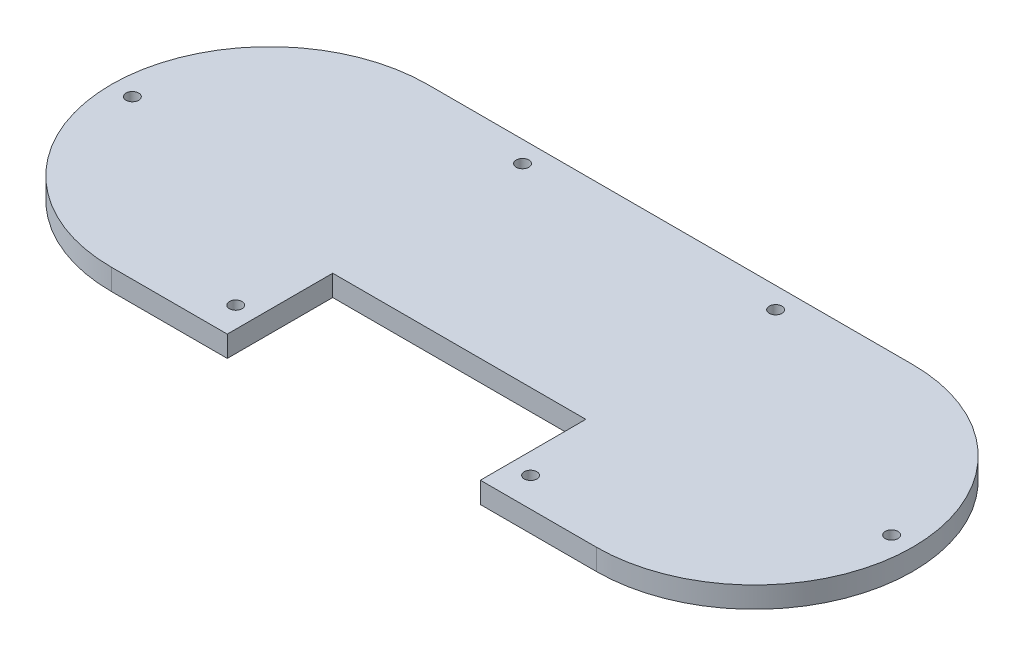
ISO-10303-21;
HEADER;
FILE_DESCRIPTION(('STEP AP214'),'2;1');
FILE_NAME('part.step','',(''),(''),'','','');
FILE_SCHEMA(('AUTOMOTIVE_DESIGN { 1 0 10303 214 1 1 1 1 }'));
ENDSEC;
DATA;
#1=APPLICATION_CONTEXT('core data for automotive mechanical design processes');
#2=APPLICATION_PROTOCOL_DEFINITION('international standard','automotive_design',2000,#1);
#3=PRODUCT_CONTEXT('',#1,'mechanical');
#4=PRODUCT('Part','Part','',(#3));
#5=PRODUCT_RELATED_PRODUCT_CATEGORY('part','',(#4));
#6=PRODUCT_DEFINITION_FORMATION('','',#4);
#7=PRODUCT_DEFINITION_CONTEXT('part definition',#1,'design');
#8=PRODUCT_DEFINITION('design','',#6,#7);
#9=PRODUCT_DEFINITION_SHAPE('','',#8);
#10=(LENGTH_UNIT() NAMED_UNIT(*) SI_UNIT(.MILLI.,.METRE.));
#11=(NAMED_UNIT(*) PLANE_ANGLE_UNIT() SI_UNIT($,.RADIAN.));
#12=(NAMED_UNIT(*) SI_UNIT($,.STERADIAN.) SOLID_ANGLE_UNIT());
#13=UNCERTAINTY_MEASURE_WITH_UNIT(LENGTH_MEASURE(1.E-05),#10,'distance_accuracy_value','');
#14=(GEOMETRIC_REPRESENTATION_CONTEXT(3) GLOBAL_UNCERTAINTY_ASSIGNED_CONTEXT((#13)) GLOBAL_UNIT_ASSIGNED_CONTEXT((#10,
#11,#12)) REPRESENTATION_CONTEXT('',''));
#15=CARTESIAN_POINT('',(0.,0.,0.));
#16=DIRECTION('',(0.,0.,1.));
#17=DIRECTION('',(1.,0.,0.));
#18=AXIS2_PLACEMENT_3D('',#15,#16,#17);
#19=CARTESIAN_POINT('',(57.5,5.,0.));
#20=DIRECTION('',(0.,1.,0.));
#21=DIRECTION('',(0.,0.,1.));
#22=AXIS2_PLACEMENT_3D('',#19,#20,#21);
#23=PLANE('',#22);
#24=CARTESIAN_POINT('',(90.,5.,0.));
#25=DIRECTION('',(0.,1.,0.));
#26=DIRECTION('',(0.,0.,1.));
#27=AXIS2_PLACEMENT_3D('',#24,#25,#26);
#28=CIRCLE('',#27,1.5);
#29=CARTESIAN_POINT('',(90.,5.,1.5));
#30=VERTEX_POINT('',#29);
#31=EDGE_CURVE('E362',#30,#30,#28,.T.);
#32=ORIENTED_EDGE('',*,*,#31,.F.);
#33=EDGE_LOOP('',(#32));
#34=FACE_BOUND('',#33,.T.);
#35=CARTESIAN_POINT('',(-30.,5.,-32.5));
#36=DIRECTION('',(0.,1.,0.));
#37=DIRECTION('',(0.,0.,1.));
#38=AXIS2_PLACEMENT_3D('',#35,#36,#37);
#39=CIRCLE('',#38,1.5);
#40=CARTESIAN_POINT('',(-30.,5.,-31.));
#41=VERTEX_POINT('',#40);
#42=EDGE_CURVE('E350',#41,#41,#39,.T.);
#43=ORIENTED_EDGE('',*,*,#42,.F.);
#44=EDGE_LOOP('',(#43));
#45=FACE_BOUND('',#44,.T.);
#46=CARTESIAN_POINT('',(-34.9497474683058,5.,30.5502525316942));
#47=DIRECTION('',(0.,1.,0.));
#48=DIRECTION('',(0.,0.,1.));
#49=AXIS2_PLACEMENT_3D('',#46,#47,#48);
#50=CIRCLE('',#49,1.50000000000002);
#51=CARTESIAN_POINT('',(-34.9497474683058,5.,32.0502525316942));
#52=VERTEX_POINT('',#51);
#53=EDGE_CURVE('E295',#52,#52,#50,.T.);
#54=ORIENTED_EDGE('',*,*,#53,.F.);
#55=EDGE_LOOP('',(#54));
#56=FACE_BOUND('',#55,.T.);
#57=DIRECTION('',(1.,0.,0.));
#58=VECTOR('',#57,1.);
#59=CARTESIAN_POINT('',(-57.5,5.,37.5));
#60=LINE('',#59,#58);
#61=CARTESIAN_POINT('',(-57.5,5.,37.5));
#62=VERTEX_POINT('',#61);
#63=CARTESIAN_POINT('',(-30.,5.,37.5));
#64=VERTEX_POINT('',#63);
#65=EDGE_CURVE('E307',#62,#64,#60,.T.);
#66=ORIENTED_EDGE('',*,*,#65,.T.);
#67=DIRECTION('',(0.,0.,-1.));
#68=VECTOR('',#67,1.);
#69=CARTESIAN_POINT('',(-30.,5.,37.5));
#70=LINE('',#69,#68);
#71=CARTESIAN_POINT('',(-30.,5.,12.5));
#72=VERTEX_POINT('',#71);
#73=EDGE_CURVE('E251',#64,#72,#70,.T.);
#74=ORIENTED_EDGE('',*,*,#73,.T.);
#75=DIRECTION('',(1.,0.,0.));
#76=VECTOR('',#75,1.);
#77=CARTESIAN_POINT('',(-30.,5.,12.5));
#78=LINE('',#77,#76);
#79=CARTESIAN_POINT('',(30.,5.,12.5));
#80=VERTEX_POINT('',#79);
#81=EDGE_CURVE('E322',#72,#80,#78,.T.);
#82=ORIENTED_EDGE('',*,*,#81,.T.);
#83=DIRECTION('',(0.,0.,1.));
#84=VECTOR('',#83,1.);
#85=CARTESIAN_POINT('',(30.,5.,12.5));
#86=LINE('',#85,#84);
#87=CARTESIAN_POINT('',(30.,5.,37.5));
#88=VERTEX_POINT('',#87);
#89=EDGE_CURVE('E335',#80,#88,#86,.T.);
#90=ORIENTED_EDGE('',*,*,#89,.T.);
#91=DIRECTION('',(1.,0.,0.));
#92=VECTOR('',#91,1.);
#93=CARTESIAN_POINT('',(30.,5.,37.5));
#94=LINE('',#93,#92);
#95=CARTESIAN_POINT('',(57.5,5.,37.5));
#96=VERTEX_POINT('',#95);
#97=EDGE_CURVE('E270',#88,#96,#94,.T.);
#98=ORIENTED_EDGE('',*,*,#97,.T.);
#99=CARTESIAN_POINT('',(57.5,5.,0.));
#100=DIRECTION('',(0.,1.,0.));
#101=DIRECTION('',(0.,0.,1.));
#102=AXIS2_PLACEMENT_3D('',#99,#100,#101);
#103=CIRCLE('',#102,37.5);
#104=CARTESIAN_POINT('',(57.5,5.,-37.5));
#105=VERTEX_POINT('',#104);
#106=EDGE_CURVE('E264',#96,#105,#103,.T.);
#107=ORIENTED_EDGE('',*,*,#106,.T.);
#108=DIRECTION('',(1.,0.,0.));
#109=VECTOR('',#108,1.);
#110=CARTESIAN_POINT('',(-57.5,5.,-37.5));
#111=LINE('',#110,#109);
#112=CARTESIAN_POINT('',(-57.5,5.,-37.5));
#113=VERTEX_POINT('',#112);
#114=EDGE_CURVE('E268',#113,#105,#111,.T.);
#115=ORIENTED_EDGE('',*,*,#114,.F.);
#116=CARTESIAN_POINT('',(-57.5,5.,0.));
#117=DIRECTION('',(0.,1.,0.));
#118=DIRECTION('',(0.,0.,1.));
#119=AXIS2_PLACEMENT_3D('',#116,#117,#118);
#120=CIRCLE('',#119,37.5);
#121=EDGE_CURVE('E212',#113,#62,#120,.T.);
#122=ORIENTED_EDGE('',*,*,#121,.T.);
#123=EDGE_LOOP('',(#66,#74,#82,#90,#98,#107,#115,#122));
#124=FACE_BOUND('',#123,.T.);
#125=CARTESIAN_POINT('',(-90.,5.,0.));
#126=DIRECTION('',(0.,1.,0.));
#127=DIRECTION('',(0.,0.,1.));
#128=AXIS2_PLACEMENT_3D('',#125,#126,#127);
#129=CIRCLE('',#128,1.5);
#130=CARTESIAN_POINT('',(-90.,5.,1.5));
#131=VERTEX_POINT('',#130);
#132=EDGE_CURVE('E344',#131,#131,#129,.T.);
#133=ORIENTED_EDGE('',*,*,#132,.F.);
#134=EDGE_LOOP('',(#133));
#135=FACE_BOUND('',#134,.T.);
#136=CARTESIAN_POINT('',(30.,5.,-32.5));
#137=DIRECTION('',(0.,1.,0.));
#138=DIRECTION('',(0.,0.,1.));
#139=AXIS2_PLACEMENT_3D('',#136,#137,#138);
#140=CIRCLE('',#139,1.50000000000001);
#141=CARTESIAN_POINT('',(30.,5.,-31.));
#142=VERTEX_POINT('',#141);
#143=EDGE_CURVE('E356',#142,#142,#140,.T.);
#144=ORIENTED_EDGE('',*,*,#143,.F.);
#145=EDGE_LOOP('',(#144));
#146=FACE_BOUND('',#145,.T.);
#147=CARTESIAN_POINT('',(34.9497474683059,5.,30.5502525316942));
#148=DIRECTION('',(0.,1.,0.));
#149=DIRECTION('',(0.,0.,1.));
#150=AXIS2_PLACEMENT_3D('',#147,#148,#149);
#151=CIRCLE('',#150,1.5);
#152=CARTESIAN_POINT('',(34.9497474683059,5.,32.0502525316942));
#153=VERTEX_POINT('',#152);
#154=EDGE_CURVE('E368',#153,#153,#151,.T.);
#155=ORIENTED_EDGE('',*,*,#154,.F.);
#156=EDGE_LOOP('',(#155));
#157=FACE_BOUND('',#156,.T.);
#158=ADVANCED_FACE('F195',(#34,#45,#56,#124,#135,#146,#157),#23,.T.);
#159=CARTESIAN_POINT('',(57.5,0.,0.));
#160=DIRECTION('',(0.,1.,0.));
#161=DIRECTION('',(0.,0.,1.));
#162=AXIS2_PLACEMENT_3D('',#159,#160,#161);
#163=PLANE('',#162);
#164=DIRECTION('',(1.,0.,0.));
#165=VECTOR('',#164,1.);
#166=CARTESIAN_POINT('',(-57.5,0.,37.5));
#167=LINE('',#166,#165);
#168=CARTESIAN_POINT('',(-57.5,0.,37.5));
#169=VERTEX_POINT('',#168);
#170=CARTESIAN_POINT('',(-30.,0.,37.5));
#171=VERTEX_POINT('',#170);
#172=EDGE_CURVE('E291',#169,#171,#167,.T.);
#173=ORIENTED_EDGE('',*,*,#172,.F.);
#174=CARTESIAN_POINT('',(-57.5,0.,0.));
#175=DIRECTION('',(0.,1.,0.));
#176=DIRECTION('',(0.,0.,1.));
#177=AXIS2_PLACEMENT_3D('',#174,#175,#176);
#178=CIRCLE('',#177,37.5);
#179=CARTESIAN_POINT('',(-57.5,0.,-37.5));
#180=VERTEX_POINT('',#179);
#181=EDGE_CURVE('E243',#180,#169,#178,.T.);
#182=ORIENTED_EDGE('',*,*,#181,.F.);
#183=DIRECTION('',(1.,0.,0.));
#184=VECTOR('',#183,1.);
#185=CARTESIAN_POINT('',(-57.5,0.,-37.5));
#186=LINE('',#185,#184);
#187=CARTESIAN_POINT('',(57.5,0.,-37.5));
#188=VERTEX_POINT('',#187);
#189=EDGE_CURVE('E304',#180,#188,#186,.T.);
#190=ORIENTED_EDGE('',*,*,#189,.T.);
#191=CARTESIAN_POINT('',(57.5,0.,0.));
#192=DIRECTION('',(0.,1.,0.));
#193=DIRECTION('',(0.,0.,1.));
#194=AXIS2_PLACEMENT_3D('',#191,#192,#193);
#195=CIRCLE('',#194,37.5);
#196=CARTESIAN_POINT('',(57.5,0.,37.5));
#197=VERTEX_POINT('',#196);
#198=EDGE_CURVE('E279',#197,#188,#195,.T.);
#199=ORIENTED_EDGE('',*,*,#198,.F.);
#200=DIRECTION('',(1.,0.,0.));
#201=VECTOR('',#200,1.);
#202=CARTESIAN_POINT('',(30.,0.,37.5));
#203=LINE('',#202,#201);
#204=CARTESIAN_POINT('',(30.,0.,37.5));
#205=VERTEX_POINT('',#204);
#206=EDGE_CURVE('E301',#205,#197,#203,.T.);
#207=ORIENTED_EDGE('',*,*,#206,.F.);
#208=DIRECTION('',(0.,0.,1.));
#209=VECTOR('',#208,1.);
#210=CARTESIAN_POINT('',(30.,0.,12.5));
#211=LINE('',#210,#209);
#212=CARTESIAN_POINT('',(30.,0.,12.5));
#213=VERTEX_POINT('',#212);
#214=EDGE_CURVE('E299',#213,#205,#211,.T.);
#215=ORIENTED_EDGE('',*,*,#214,.F.);
#216=DIRECTION('',(1.,0.,0.));
#217=VECTOR('',#216,1.);
#218=CARTESIAN_POINT('',(-30.,0.,12.5));
#219=LINE('',#218,#217);
#220=CARTESIAN_POINT('',(-30.,0.,12.5));
#221=VERTEX_POINT('',#220);
#222=EDGE_CURVE('E297',#221,#213,#219,.T.);
#223=ORIENTED_EDGE('',*,*,#222,.F.);
#224=DIRECTION('',(0.,0.,-1.));
#225=VECTOR('',#224,1.);
#226=CARTESIAN_POINT('',(-30.,0.,37.5));
#227=LINE('',#226,#225);
#228=EDGE_CURVE('E294',#171,#221,#227,.T.);
#229=ORIENTED_EDGE('',*,*,#228,.F.);
#230=EDGE_LOOP('',(#173,#182,#190,#199,#207,#215,#223,#229));
#231=FACE_BOUND('',#230,.T.);
#232=CARTESIAN_POINT('',(-34.9497474683058,0.,30.5502525316942));
#233=DIRECTION('',(0.,1.,0.));
#234=DIRECTION('',(0.,0.,1.));
#235=AXIS2_PLACEMENT_3D('',#232,#233,#234);
#236=CIRCLE('',#235,1.50000000000002);
#237=CARTESIAN_POINT('',(-34.9497474683058,0.,32.0502525316942));
#238=VERTEX_POINT('',#237);
#239=EDGE_CURVE('E341',#238,#238,#236,.T.);
#240=ORIENTED_EDGE('',*,*,#239,.T.);
#241=EDGE_LOOP('',(#240));
#242=FACE_BOUND('',#241,.T.);
#243=CARTESIAN_POINT('',(-90.,0.,0.));
#244=DIRECTION('',(0.,1.,0.));
#245=DIRECTION('',(0.,0.,1.));
#246=AXIS2_PLACEMENT_3D('',#243,#244,#245);
#247=CIRCLE('',#246,1.5);
#248=CARTESIAN_POINT('',(-90.,0.,1.5));
#249=VERTEX_POINT('',#248);
#250=EDGE_CURVE('E347',#249,#249,#247,.T.);
#251=ORIENTED_EDGE('',*,*,#250,.T.);
#252=EDGE_LOOP('',(#251));
#253=FACE_BOUND('',#252,.T.);
#254=CARTESIAN_POINT('',(-30.,0.,-32.5));
#255=DIRECTION('',(0.,1.,0.));
#256=DIRECTION('',(0.,0.,1.));
#257=AXIS2_PLACEMENT_3D('',#254,#255,#256);
#258=CIRCLE('',#257,1.5);
#259=CARTESIAN_POINT('',(-30.,0.,-31.));
#260=VERTEX_POINT('',#259);
#261=EDGE_CURVE('E353',#260,#260,#258,.T.);
#262=ORIENTED_EDGE('',*,*,#261,.T.);
#263=EDGE_LOOP('',(#262));
#264=FACE_BOUND('',#263,.T.);
#265=CARTESIAN_POINT('',(30.,0.,-32.5));
#266=DIRECTION('',(0.,1.,0.));
#267=DIRECTION('',(0.,0.,1.));
#268=AXIS2_PLACEMENT_3D('',#265,#266,#267);
#269=CIRCLE('',#268,1.50000000000001);
#270=CARTESIAN_POINT('',(30.,0.,-31.));
#271=VERTEX_POINT('',#270);
#272=EDGE_CURVE('E359',#271,#271,#269,.T.);
#273=ORIENTED_EDGE('',*,*,#272,.T.);
#274=EDGE_LOOP('',(#273));
#275=FACE_BOUND('',#274,.T.);
#276=CARTESIAN_POINT('',(90.,0.,0.));
#277=DIRECTION('',(0.,1.,0.));
#278=DIRECTION('',(0.,0.,1.));
#279=AXIS2_PLACEMENT_3D('',#276,#277,#278);
#280=CIRCLE('',#279,1.5);
#281=CARTESIAN_POINT('',(90.,0.,1.5));
#282=VERTEX_POINT('',#281);
#283=EDGE_CURVE('E365',#282,#282,#280,.T.);
#284=ORIENTED_EDGE('',*,*,#283,.T.);
#285=EDGE_LOOP('',(#284));
#286=FACE_BOUND('',#285,.T.);
#287=CARTESIAN_POINT('',(34.9497474683059,0.,30.5502525316942));
#288=DIRECTION('',(0.,1.,0.));
#289=DIRECTION('',(0.,0.,1.));
#290=AXIS2_PLACEMENT_3D('',#287,#288,#289);
#291=CIRCLE('',#290,1.5);
#292=CARTESIAN_POINT('',(34.9497474683059,0.,32.0502525316942));
#293=VERTEX_POINT('',#292);
#294=EDGE_CURVE('E371',#293,#293,#291,.T.);
#295=ORIENTED_EDGE('',*,*,#294,.T.);
#296=EDGE_LOOP('',(#295));
#297=FACE_BOUND('',#296,.T.);
#298=ADVANCED_FACE('F326',(#231,#242,#253,#264,#275,#286,#297),#163,.F.);
#299=CARTESIAN_POINT('',(-57.5,5.,37.5));
#300=DIRECTION('',(0.,0.,-1.));
#301=DIRECTION('',(-1.,0.,0.));
#302=AXIS2_PLACEMENT_3D('',#299,#300,#301);
#303=PLANE('',#302);
#304=ORIENTED_EDGE('',*,*,#172,.T.);
#305=DIRECTION('',(0.,-1.,0.));
#306=VECTOR('',#305,1.);
#307=CARTESIAN_POINT('',(-30.,5.,37.5));
#308=LINE('',#307,#306);
#309=EDGE_CURVE('E12',#64,#171,#308,.T.);
#310=ORIENTED_EDGE('',*,*,#309,.F.);
#311=ORIENTED_EDGE('',*,*,#65,.F.);
#312=DIRECTION('',(0.,-1.,0.));
#313=VECTOR('',#312,1.);
#314=CARTESIAN_POINT('',(-57.5,5.,37.5));
#315=LINE('',#314,#313);
#316=EDGE_CURVE('E287',#62,#169,#315,.T.);
#317=ORIENTED_EDGE('',*,*,#316,.T.);
#318=EDGE_LOOP('',(#304,#310,#311,#317));
#319=FACE_BOUND('',#318,.T.);
#320=ADVANCED_FACE('F197',(#319),#303,.F.);
#321=CARTESIAN_POINT('',(-30.,5.,37.5));
#322=DIRECTION('',(-1.,0.,0.));
#323=DIRECTION('',(0.,0.,1.));
#324=AXIS2_PLACEMENT_3D('',#321,#322,#323);
#325=PLANE('',#324);
#326=ORIENTED_EDGE('',*,*,#228,.T.);
#327=DIRECTION('',(0.,-1.,0.));
#328=VECTOR('',#327,1.);
#329=CARTESIAN_POINT('',(-30.,5.,12.5));
#330=LINE('',#329,#328);
#331=EDGE_CURVE('E204',#72,#221,#330,.T.);
#332=ORIENTED_EDGE('',*,*,#331,.F.);
#333=ORIENTED_EDGE('',*,*,#73,.F.);
#334=ORIENTED_EDGE('',*,*,#309,.T.);
#335=EDGE_LOOP('',(#326,#332,#333,#334));
#336=FACE_BOUND('',#335,.T.);
#337=ADVANCED_FACE('F405',(#336),#325,.F.);
#338=CARTESIAN_POINT('',(-30.,5.,12.5));
#339=DIRECTION('',(0.,0.,-1.));
#340=DIRECTION('',(-1.,0.,0.));
#341=AXIS2_PLACEMENT_3D('',#338,#339,#340);
#342=PLANE('',#341);
#343=ORIENTED_EDGE('',*,*,#222,.T.);
#344=DIRECTION('',(0.,-1.,0.));
#345=VECTOR('',#344,1.);
#346=CARTESIAN_POINT('',(30.,5.,12.5));
#347=LINE('',#346,#345);
#348=EDGE_CURVE('E314',#80,#213,#347,.T.);
#349=ORIENTED_EDGE('',*,*,#348,.F.);
#350=ORIENTED_EDGE('',*,*,#81,.F.);
#351=ORIENTED_EDGE('',*,*,#331,.T.);
#352=EDGE_LOOP('',(#343,#349,#350,#351));
#353=FACE_BOUND('',#352,.T.);
#354=ADVANCED_FACE('F320',(#353),#342,.F.);
#355=CARTESIAN_POINT('',(30.,5.,12.5));
#356=DIRECTION('',(1.,0.,0.));
#357=DIRECTION('',(0.,0.,-1.));
#358=AXIS2_PLACEMENT_3D('',#355,#356,#357);
#359=PLANE('',#358);
#360=ORIENTED_EDGE('',*,*,#214,.T.);
#361=DIRECTION('',(0.,-1.,0.));
#362=VECTOR('',#361,1.);
#363=CARTESIAN_POINT('',(30.,5.,37.5));
#364=LINE('',#363,#362);
#365=EDGE_CURVE('E311',#88,#205,#364,.T.);
#366=ORIENTED_EDGE('',*,*,#365,.F.);
#367=ORIENTED_EDGE('',*,*,#89,.F.);
#368=ORIENTED_EDGE('',*,*,#348,.T.);
#369=EDGE_LOOP('',(#360,#366,#367,#368));
#370=FACE_BOUND('',#369,.T.);
#371=ADVANCED_FACE('F331',(#370),#359,.F.);
#372=CARTESIAN_POINT('',(30.,5.,37.5));
#373=DIRECTION('',(0.,0.,-1.));
#374=DIRECTION('',(-1.,0.,0.));
#375=AXIS2_PLACEMENT_3D('',#372,#373,#374);
#376=PLANE('',#375);
#377=ORIENTED_EDGE('',*,*,#206,.T.);
#378=DIRECTION('',(0.,-1.,0.));
#379=VECTOR('',#378,1.);
#380=CARTESIAN_POINT('',(57.5,5.,37.5));
#381=LINE('',#380,#379);
#382=EDGE_CURVE('E283',#96,#197,#381,.T.);
#383=ORIENTED_EDGE('',*,*,#382,.F.);
#384=ORIENTED_EDGE('',*,*,#97,.F.);
#385=ORIENTED_EDGE('',*,*,#365,.T.);
#386=EDGE_LOOP('',(#377,#383,#384,#385));
#387=FACE_BOUND('',#386,.T.);
#388=ADVANCED_FACE('F334',(#387),#376,.F.);
#389=CARTESIAN_POINT('',(57.5,5.,0.));
#390=DIRECTION('',(0.,-1.,0.));
#391=DIRECTION('',(0.,0.,-1.));
#392=AXIS2_PLACEMENT_3D('',#389,#390,#391);
#393=CYLINDRICAL_SURFACE('',#392,37.5);
#394=ORIENTED_EDGE('',*,*,#198,.T.);
#395=DIRECTION('',(0.,-1.,0.));
#396=VECTOR('',#395,1.);
#397=CARTESIAN_POINT('',(57.5,5.,-37.5));
#398=LINE('',#397,#396);
#399=EDGE_CURVE('E276',#105,#188,#398,.T.);
#400=ORIENTED_EDGE('',*,*,#399,.F.);
#401=ORIENTED_EDGE('',*,*,#106,.F.);
#402=ORIENTED_EDGE('',*,*,#382,.T.);
#403=EDGE_LOOP('',(#394,#400,#401,#402));
#404=FACE_BOUND('',#403,.T.);
#405=ADVANCED_FACE('F277',(#404),#393,.T.);
#406=CARTESIAN_POINT('',(-57.5,5.,-37.5));
#407=DIRECTION('',(0.,0.,-1.));
#408=DIRECTION('',(-1.,0.,0.));
#409=AXIS2_PLACEMENT_3D('',#406,#407,#408);
#410=PLANE('',#409);
#411=ORIENTED_EDGE('',*,*,#189,.F.);
#412=DIRECTION('',(0.,-1.,0.));
#413=VECTOR('',#412,1.);
#414=CARTESIAN_POINT('',(-57.5,5.,-37.5));
#415=LINE('',#414,#413);
#416=EDGE_CURVE('E240',#113,#180,#415,.T.);
#417=ORIENTED_EDGE('',*,*,#416,.F.);
#418=ORIENTED_EDGE('',*,*,#114,.T.);
#419=ORIENTED_EDGE('',*,*,#399,.T.);
#420=EDGE_LOOP('',(#411,#417,#418,#419));
#421=FACE_BOUND('',#420,.T.);
#422=ADVANCED_FACE('F285',(#421),#410,.T.);
#423=CARTESIAN_POINT('',(-57.5,5.,0.));
#424=DIRECTION('',(0.,-1.,0.));
#425=DIRECTION('',(0.,0.,-1.));
#426=AXIS2_PLACEMENT_3D('',#423,#424,#425);
#427=CYLINDRICAL_SURFACE('',#426,37.5);
#428=ORIENTED_EDGE('',*,*,#181,.T.);
#429=ORIENTED_EDGE('',*,*,#316,.F.);
#430=ORIENTED_EDGE('',*,*,#121,.F.);
#431=ORIENTED_EDGE('',*,*,#416,.T.);
#432=EDGE_LOOP('',(#428,#429,#430,#431));
#433=FACE_BOUND('',#432,.T.);
#434=ADVANCED_FACE('F393',(#433),#427,.T.);
#435=CARTESIAN_POINT('',(-34.9497474683058,5.,30.5502525316942));
#436=DIRECTION('',(0.,-1.,0.));
#437=DIRECTION('',(0.,0.,-1.));
#438=AXIS2_PLACEMENT_3D('',#435,#436,#437);
#439=CYLINDRICAL_SURFACE('',#438,1.50000000000002);
#440=ORIENTED_EDGE('',*,*,#53,.T.);
#441=EDGE_LOOP('',(#440));
#442=FACE_BOUND('',#441,.T.);
#443=ORIENTED_EDGE('',*,*,#239,.F.);
#444=EDGE_LOOP('',(#443));
#445=FACE_BOUND('',#444,.T.);
#446=ADVANCED_FACE('F390',(#442,#445),#439,.F.);
#447=CARTESIAN_POINT('',(-90.,5.,0.));
#448=DIRECTION('',(0.,-1.,0.));
#449=DIRECTION('',(0.,0.,-1.));
#450=AXIS2_PLACEMENT_3D('',#447,#448,#449);
#451=CYLINDRICAL_SURFACE('',#450,1.5);
#452=ORIENTED_EDGE('',*,*,#132,.T.);
#453=EDGE_LOOP('',(#452));
#454=FACE_BOUND('',#453,.T.);
#455=ORIENTED_EDGE('',*,*,#250,.F.);
#456=EDGE_LOOP('',(#455));
#457=FACE_BOUND('',#456,.T.);
#458=ADVANCED_FACE('F469',(#454,#457),#451,.F.);
#459=CARTESIAN_POINT('',(-30.,5.,-32.5));
#460=DIRECTION('',(0.,-1.,0.));
#461=DIRECTION('',(0.,0.,-1.));
#462=AXIS2_PLACEMENT_3D('',#459,#460,#461);
#463=CYLINDRICAL_SURFACE('',#462,1.5);
#464=ORIENTED_EDGE('',*,*,#42,.T.);
#465=EDGE_LOOP('',(#464));
#466=FACE_BOUND('',#465,.T.);
#467=ORIENTED_EDGE('',*,*,#261,.F.);
#468=EDGE_LOOP('',(#467));
#469=FACE_BOUND('',#468,.T.);
#470=ADVANCED_FACE('F477',(#466,#469),#463,.F.);
#471=CARTESIAN_POINT('',(30.,5.,-32.5));
#472=DIRECTION('',(0.,-1.,0.));
#473=DIRECTION('',(0.,0.,-1.));
#474=AXIS2_PLACEMENT_3D('',#471,#472,#473);
#475=CYLINDRICAL_SURFACE('',#474,1.50000000000001);
#476=ORIENTED_EDGE('',*,*,#143,.T.);
#477=EDGE_LOOP('',(#476));
#478=FACE_BOUND('',#477,.T.);
#479=ORIENTED_EDGE('',*,*,#272,.F.);
#480=EDGE_LOOP('',(#479));
#481=FACE_BOUND('',#480,.T.);
#482=ADVANCED_FACE('F485',(#478,#481),#475,.F.);
#483=CARTESIAN_POINT('',(90.,5.,0.));
#484=DIRECTION('',(0.,-1.,0.));
#485=DIRECTION('',(0.,0.,-1.));
#486=AXIS2_PLACEMENT_3D('',#483,#484,#485);
#487=CYLINDRICAL_SURFACE('',#486,1.5);
#488=ORIENTED_EDGE('',*,*,#31,.T.);
#489=EDGE_LOOP('',(#488));
#490=FACE_BOUND('',#489,.T.);
#491=ORIENTED_EDGE('',*,*,#283,.F.);
#492=EDGE_LOOP('',(#491));
#493=FACE_BOUND('',#492,.T.);
#494=ADVANCED_FACE('F494',(#490,#493),#487,.F.);
#495=CARTESIAN_POINT('',(34.9497474683059,5.,30.5502525316942));
#496=DIRECTION('',(0.,-1.,0.));
#497=DIRECTION('',(0.,0.,-1.));
#498=AXIS2_PLACEMENT_3D('',#495,#496,#497);
#499=CYLINDRICAL_SURFACE('',#498,1.5);
#500=ORIENTED_EDGE('',*,*,#154,.T.);
#501=EDGE_LOOP('',(#500));
#502=FACE_BOUND('',#501,.T.);
#503=ORIENTED_EDGE('',*,*,#294,.F.);
#504=EDGE_LOOP('',(#503));
#505=FACE_BOUND('',#504,.T.);
#506=ADVANCED_FACE('F377',(#502,#505),#499,.F.);
#507=CLOSED_SHELL('',(#158,#298,#320,#337,#354,#371,#388,#405,#422,#434,#446,#458,#470,#482,
#494,#506));
#508=MANIFOLD_SOLID_BREP('B2',#507);
#509=ADVANCED_BREP_SHAPE_REPRESENTATION('',(#18,#508),#14);
#510=SHAPE_DEFINITION_REPRESENTATION(#9,#509);
ENDSEC;
END-ISO-10303-21;
